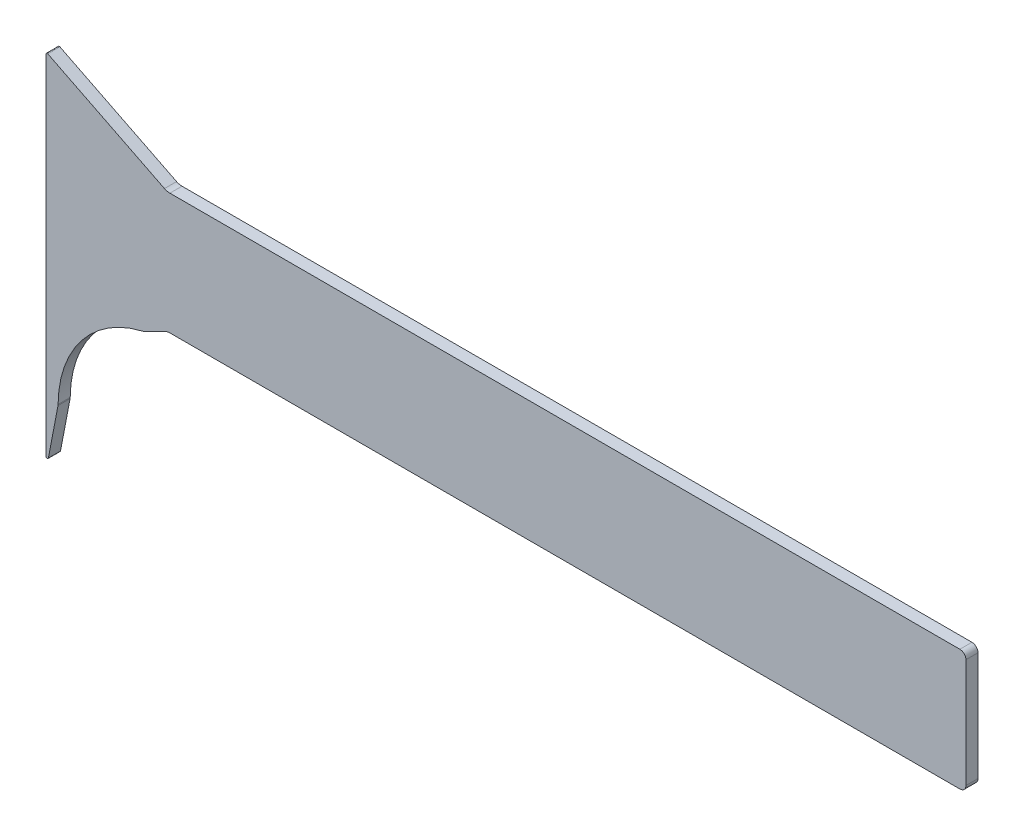
ISO-10303-21;
HEADER;
FILE_DESCRIPTION(('STEP AP214'),'2;1');
FILE_NAME('part.step','',(''),(''),'','','');
FILE_SCHEMA(('AUTOMOTIVE_DESIGN { 1 0 10303 214 1 1 1 1 }'));
ENDSEC;
DATA;
#1=APPLICATION_CONTEXT('core data for automotive mechanical design processes');
#2=APPLICATION_PROTOCOL_DEFINITION('international standard','automotive_design',2000,#1);
#3=PRODUCT_CONTEXT('',#1,'mechanical');
#4=PRODUCT('Part','Part','',(#3));
#5=PRODUCT_RELATED_PRODUCT_CATEGORY('part','',(#4));
#6=PRODUCT_DEFINITION_FORMATION('','',#4);
#7=PRODUCT_DEFINITION_CONTEXT('part definition',#1,'design');
#8=PRODUCT_DEFINITION('design','',#6,#7);
#9=PRODUCT_DEFINITION_SHAPE('','',#8);
#10=(LENGTH_UNIT() NAMED_UNIT(*) SI_UNIT(.MILLI.,.METRE.));
#11=(NAMED_UNIT(*) PLANE_ANGLE_UNIT() SI_UNIT($,.RADIAN.));
#12=(NAMED_UNIT(*) SI_UNIT($,.STERADIAN.) SOLID_ANGLE_UNIT());
#13=UNCERTAINTY_MEASURE_WITH_UNIT(LENGTH_MEASURE(1.E-05),#10,'distance_accuracy_value','');
#14=(GEOMETRIC_REPRESENTATION_CONTEXT(3) GLOBAL_UNCERTAINTY_ASSIGNED_CONTEXT((#13)) GLOBAL_UNIT_ASSIGNED_CONTEXT((#10,
#11,#12)) REPRESENTATION_CONTEXT('',''));
#15=CARTESIAN_POINT('',(0.,0.,0.));
#16=DIRECTION('',(0.,0.,1.));
#17=DIRECTION('',(1.,0.,0.));
#18=AXIS2_PLACEMENT_3D('',#15,#16,#17);
#19=CARTESIAN_POINT('',(102.360679777415,-60.0000000007318,10.));
#20=DIRECTION('',(0.,0.,-1.));
#21=DIRECTION('',(-1.,0.,0.));
#22=AXIS2_PLACEMENT_3D('',#19,#20,#21);
#23=CYLINDRICAL_SURFACE('',#22,10.);
#24=CARTESIAN_POINT('',(102.360679777415,-60.0000000007318,0.));
#25=DIRECTION('',(0.,0.,-1.));
#26=DIRECTION('',(-1.,0.,0.));
#27=AXIS2_PLACEMENT_3D('',#24,#25,#26);
#28=CIRCLE('',#27,10.);
#29=CARTESIAN_POINT('',(97.8885438183196,-51.0557280927806,0.));
#30=VERTEX_POINT('',#29);
#31=CARTESIAN_POINT('',(102.360679777415,-50.0000000007318,0.));
#32=VERTEX_POINT('',#31);
#33=EDGE_CURVE('E177',#30,#32,#28,.T.);
#34=ORIENTED_EDGE('',*,*,#33,.T.);
#35=DIRECTION('',(0.,0.,-1.));
#36=VECTOR('',#35,1.);
#37=CARTESIAN_POINT('',(102.360679777415,-50.0000000007318,10.));
#38=LINE('',#37,#36);
#39=CARTESIAN_POINT('',(102.360679777415,-50.0000000007318,10.));
#40=VERTEX_POINT('',#39);
#41=EDGE_CURVE('E11',#40,#32,#38,.T.);
#42=ORIENTED_EDGE('',*,*,#41,.F.);
#43=CARTESIAN_POINT('',(102.360679777415,-60.0000000007318,10.));
#44=DIRECTION('',(0.,0.,-1.));
#45=DIRECTION('',(-1.,0.,0.));
#46=AXIS2_PLACEMENT_3D('',#43,#44,#45);
#47=CIRCLE('',#46,10.);
#48=CARTESIAN_POINT('',(97.8885438183196,-51.0557280927806,10.));
#49=VERTEX_POINT('',#48);
#50=EDGE_CURVE('E207',#49,#40,#47,.T.);
#51=ORIENTED_EDGE('',*,*,#50,.F.);
#52=DIRECTION('',(0.,0.,-1.));
#53=VECTOR('',#52,1.);
#54=CARTESIAN_POINT('',(97.8885438183196,-51.0557280927806,10.));
#55=LINE('',#54,#53);
#56=EDGE_CURVE('E173',#49,#30,#55,.T.);
#57=ORIENTED_EDGE('',*,*,#56,.T.);
#58=EDGE_LOOP('',(#34,#42,#51,#57));
#59=FACE_BOUND('',#58,.T.);
#60=ADVANCED_FACE('F33',(#59),#23,.F.);
#61=CARTESIAN_POINT('',(102.360679777415,-50.0000000007318,10.));
#62=DIRECTION('',(0.,1.,0.));
#63=DIRECTION('',(0.,0.,1.));
#64=AXIS2_PLACEMENT_3D('',#61,#62,#63);
#65=PLANE('',#64);
#66=DIRECTION('',(1.,0.,0.));
#67=VECTOR('',#66,1.);
#68=CARTESIAN_POINT('',(102.360679777415,-50.0000000007318,0.));
#69=LINE('',#68,#67);
#70=CARTESIAN_POINT('',(755.,-50.0000000007318,0.));
#71=VERTEX_POINT('',#70);
#72=EDGE_CURVE('E180',#32,#71,#69,.T.);
#73=ORIENTED_EDGE('',*,*,#72,.T.);
#74=DIRECTION('',(0.,0.,-1.));
#75=VECTOR('',#74,1.);
#76=CARTESIAN_POINT('',(755.,-50.0000000007318,10.));
#77=LINE('',#76,#75);
#78=CARTESIAN_POINT('',(755.,-50.0000000007318,10.));
#79=VERTEX_POINT('',#78);
#80=EDGE_CURVE('E41',#79,#71,#77,.T.);
#81=ORIENTED_EDGE('',*,*,#80,.F.);
#82=DIRECTION('',(1.,0.,0.));
#83=VECTOR('',#82,1.);
#84=CARTESIAN_POINT('',(102.360679777415,-50.0000000007318,10.));
#85=LINE('',#84,#83);
#86=EDGE_CURVE('E116',#40,#79,#85,.T.);
#87=ORIENTED_EDGE('',*,*,#86,.F.);
#88=ORIENTED_EDGE('',*,*,#41,.T.);
#89=EDGE_LOOP('',(#73,#81,#87,#88));
#90=FACE_BOUND('',#89,.T.);
#91=ADVANCED_FACE('F305',(#90),#65,.F.);
#92=CARTESIAN_POINT('',(755.,-45.0000000007318,10.));
#93=DIRECTION('',(0.,0.,-1.));
#94=DIRECTION('',(-1.,0.,0.));
#95=AXIS2_PLACEMENT_3D('',#92,#93,#94);
#96=CYLINDRICAL_SURFACE('',#95,5.);
#97=CARTESIAN_POINT('',(755.,-45.0000000007318,0.));
#98=DIRECTION('',(0.,0.,1.));
#99=DIRECTION('',(1.,0.,0.));
#100=AXIS2_PLACEMENT_3D('',#97,#98,#99);
#101=CIRCLE('',#100,5.);
#102=CARTESIAN_POINT('',(760.,-45.0000000007318,0.));
#103=VERTEX_POINT('',#102);
#104=EDGE_CURVE('E182',#71,#103,#101,.T.);
#105=ORIENTED_EDGE('',*,*,#104,.T.);
#106=DIRECTION('',(0.,0.,-1.));
#107=VECTOR('',#106,1.);
#108=CARTESIAN_POINT('',(760.,-45.0000000007318,10.));
#109=LINE('',#108,#107);
#110=CARTESIAN_POINT('',(760.,-45.0000000007318,10.));
#111=VERTEX_POINT('',#110);
#112=EDGE_CURVE('E238',#111,#103,#109,.T.);
#113=ORIENTED_EDGE('',*,*,#112,.F.);
#114=CARTESIAN_POINT('',(755.,-45.0000000007318,10.));
#115=DIRECTION('',(0.,0.,1.));
#116=DIRECTION('',(1.,0.,0.));
#117=AXIS2_PLACEMENT_3D('',#114,#115,#116);
#118=CIRCLE('',#117,5.);
#119=EDGE_CURVE('E246',#79,#111,#118,.T.);
#120=ORIENTED_EDGE('',*,*,#119,.F.);
#121=ORIENTED_EDGE('',*,*,#80,.T.);
#122=EDGE_LOOP('',(#105,#113,#120,#121));
#123=FACE_BOUND('',#122,.T.);
#124=ADVANCED_FACE('F244',(#123),#96,.T.);
#125=CARTESIAN_POINT('',(760.,-45.0000000007318,10.));
#126=DIRECTION('',(-1.,0.,0.));
#127=DIRECTION('',(0.,0.,1.));
#128=AXIS2_PLACEMENT_3D('',#125,#126,#127);
#129=PLANE('',#128);
#130=DIRECTION('',(0.,1.,0.));
#131=VECTOR('',#130,1.);
#132=CARTESIAN_POINT('',(760.,-45.0000000007318,0.));
#133=LINE('',#132,#131);
#134=CARTESIAN_POINT('',(760.,45.,0.));
#135=VERTEX_POINT('',#134);
#136=EDGE_CURVE('E184',#103,#135,#133,.T.);
#137=ORIENTED_EDGE('',*,*,#136,.T.);
#138=DIRECTION('',(0.,0.,-1.));
#139=VECTOR('',#138,1.);
#140=CARTESIAN_POINT('',(760.,45.,10.));
#141=LINE('',#140,#139);
#142=CARTESIAN_POINT('',(760.,45.,10.));
#143=VERTEX_POINT('',#142);
#144=EDGE_CURVE('E235',#143,#135,#141,.T.);
#145=ORIENTED_EDGE('',*,*,#144,.F.);
#146=DIRECTION('',(0.,1.,0.));
#147=VECTOR('',#146,1.);
#148=CARTESIAN_POINT('',(760.,-45.0000000007318,10.));
#149=LINE('',#148,#147);
#150=EDGE_CURVE('E264',#111,#143,#149,.T.);
#151=ORIENTED_EDGE('',*,*,#150,.F.);
#152=ORIENTED_EDGE('',*,*,#112,.T.);
#153=EDGE_LOOP('',(#137,#145,#151,#152));
#154=FACE_BOUND('',#153,.T.);
#155=ADVANCED_FACE('F255',(#154),#129,.F.);
#156=CARTESIAN_POINT('',(755.,45.0000000000001,10.));
#157=DIRECTION('',(0.,0.,-1.));
#158=DIRECTION('',(-1.,0.,0.));
#159=AXIS2_PLACEMENT_3D('',#156,#157,#158);
#160=CYLINDRICAL_SURFACE('',#159,5.);
#161=CARTESIAN_POINT('',(755.,45.0000000000001,0.));
#162=DIRECTION('',(0.,0.,1.));
#163=DIRECTION('',(1.,0.,0.));
#164=AXIS2_PLACEMENT_3D('',#161,#162,#163);
#165=CIRCLE('',#164,5.);
#166=CARTESIAN_POINT('',(755.,50.0000000000001,0.));
#167=VERTEX_POINT('',#166);
#168=EDGE_CURVE('E186',#135,#167,#165,.T.);
#169=ORIENTED_EDGE('',*,*,#168,.T.);
#170=DIRECTION('',(0.,0.,-1.));
#171=VECTOR('',#170,1.);
#172=CARTESIAN_POINT('',(755.,50.0000000000001,10.));
#173=LINE('',#172,#171);
#174=CARTESIAN_POINT('',(755.,50.0000000000001,10.));
#175=VERTEX_POINT('',#174);
#176=EDGE_CURVE('E232',#175,#167,#173,.T.);
#177=ORIENTED_EDGE('',*,*,#176,.F.);
#178=CARTESIAN_POINT('',(755.,45.0000000000001,10.));
#179=DIRECTION('',(0.,0.,1.));
#180=DIRECTION('',(1.,0.,0.));
#181=AXIS2_PLACEMENT_3D('',#178,#179,#180);
#182=CIRCLE('',#181,5.);
#183=EDGE_CURVE('E261',#143,#175,#182,.T.);
#184=ORIENTED_EDGE('',*,*,#183,.F.);
#185=ORIENTED_EDGE('',*,*,#144,.T.);
#186=EDGE_LOOP('',(#169,#177,#184,#185));
#187=FACE_BOUND('',#186,.T.);
#188=ADVANCED_FACE('F259',(#187),#160,.T.);
#189=CARTESIAN_POINT('',(755.,50.0000000000001,10.));
#190=DIRECTION('',(0.,-1.,0.));
#191=DIRECTION('',(1.,0.,0.));
#192=AXIS2_PLACEMENT_3D('',#189,#190,#191);
#193=PLANE('',#192);
#194=DIRECTION('',(-1.,0.,0.));
#195=VECTOR('',#194,1.);
#196=CARTESIAN_POINT('',(755.,50.0000000000001,0.));
#197=LINE('',#196,#195);
#198=CARTESIAN_POINT('',(102.360679774998,50.,0.));
#199=VERTEX_POINT('',#198);
#200=EDGE_CURVE('E188',#167,#199,#197,.T.);
#201=ORIENTED_EDGE('',*,*,#200,.T.);
#202=DIRECTION('',(0.,0.,-1.));
#203=VECTOR('',#202,1.);
#204=CARTESIAN_POINT('',(102.360679774998,50.,10.));
#205=LINE('',#204,#203);
#206=CARTESIAN_POINT('',(102.360679774998,50.,10.));
#207=VERTEX_POINT('',#206);
#208=EDGE_CURVE('E229',#207,#199,#205,.T.);
#209=ORIENTED_EDGE('',*,*,#208,.F.);
#210=DIRECTION('',(-1.,0.,0.));
#211=VECTOR('',#210,1.);
#212=CARTESIAN_POINT('',(755.,50.0000000000001,10.));
#213=LINE('',#212,#211);
#214=EDGE_CURVE('E263',#175,#207,#213,.T.);
#215=ORIENTED_EDGE('',*,*,#214,.F.);
#216=ORIENTED_EDGE('',*,*,#176,.T.);
#217=EDGE_LOOP('',(#201,#209,#215,#216));
#218=FACE_BOUND('',#217,.T.);
#219=ADVANCED_FACE('F318',(#218),#193,.F.);
#220=CARTESIAN_POINT('',(102.360679774998,60.,10.));
#221=DIRECTION('',(0.,0.,-1.));
#222=DIRECTION('',(-1.,0.,0.));
#223=AXIS2_PLACEMENT_3D('',#220,#221,#222);
#224=CYLINDRICAL_SURFACE('',#223,10.);
#225=CARTESIAN_POINT('',(102.360679774998,60.,0.));
#226=DIRECTION('',(0.,0.,-1.));
#227=DIRECTION('',(1.,0.,0.));
#228=AXIS2_PLACEMENT_3D('',#225,#226,#227);
#229=CIRCLE('',#228,10.);
#230=CARTESIAN_POINT('',(97.8885438199983,51.0557280900008,0.));
#231=VERTEX_POINT('',#230);
#232=EDGE_CURVE('E190',#199,#231,#229,.T.);
#233=ORIENTED_EDGE('',*,*,#232,.T.);
#234=DIRECTION('',(0.,0.,-1.));
#235=VECTOR('',#234,1.);
#236=CARTESIAN_POINT('',(97.8885438199983,51.0557280900008,10.));
#237=LINE('',#236,#235);
#238=CARTESIAN_POINT('',(97.8885438199983,51.0557280900008,10.));
#239=VERTEX_POINT('',#238);
#240=EDGE_CURVE('E226',#239,#231,#237,.T.);
#241=ORIENTED_EDGE('',*,*,#240,.F.);
#242=CARTESIAN_POINT('',(102.360679774998,60.,10.));
#243=DIRECTION('',(0.,0.,-1.));
#244=DIRECTION('',(1.,0.,0.));
#245=AXIS2_PLACEMENT_3D('',#242,#243,#244);
#246=CIRCLE('',#245,10.);
#247=EDGE_CURVE('E266',#207,#239,#246,.T.);
#248=ORIENTED_EDGE('',*,*,#247,.F.);
#249=ORIENTED_EDGE('',*,*,#208,.T.);
#250=EDGE_LOOP('',(#233,#241,#248,#249));
#251=FACE_BOUND('',#250,.T.);
#252=ADVANCED_FACE('F321',(#251),#224,.F.);
#253=CARTESIAN_POINT('',(1.44721359549995,99.2763932022501,10.));
#254=DIRECTION('',(-0.447213595499958,-0.894427190999916,0.));
#255=DIRECTION('',(0.894427190999916,-0.447213595499958,0.));
#256=AXIS2_PLACEMENT_3D('',#253,#254,#255);
#257=PLANE('',#256);
#258=DIRECTION('',(-0.894427190999916,0.447213595499958,0.));
#259=VECTOR('',#258,1.);
#260=CARTESIAN_POINT('',(1.44721359549995,99.2763932022501,0.));
#261=LINE('',#260,#259);
#262=CARTESIAN_POINT('',(1.44721359549995,99.2763932022501,0.));
#263=VERTEX_POINT('',#262);
#264=EDGE_CURVE('E192',#231,#263,#261,.T.);
#265=ORIENTED_EDGE('',*,*,#264,.T.);
#266=DIRECTION('',(0.,0.,-1.));
#267=VECTOR('',#266,1.);
#268=CARTESIAN_POINT('',(1.44721359549995,99.2763932022501,10.));
#269=LINE('',#268,#267);
#270=CARTESIAN_POINT('',(1.44721359549995,99.2763932022501,10.));
#271=VERTEX_POINT('',#270);
#272=EDGE_CURVE('E223',#271,#263,#269,.T.);
#273=ORIENTED_EDGE('',*,*,#272,.F.);
#274=DIRECTION('',(-0.894427190999916,0.447213595499958,0.));
#275=VECTOR('',#274,1.);
#276=CARTESIAN_POINT('',(1.44721359549995,99.2763932022501,10.));
#277=LINE('',#276,#275);
#278=EDGE_CURVE('E272',#239,#271,#277,.T.);
#279=ORIENTED_EDGE('',*,*,#278,.F.);
#280=ORIENTED_EDGE('',*,*,#240,.T.);
#281=EDGE_LOOP('',(#265,#273,#279,#280));
#282=FACE_BOUND('',#281,.T.);
#283=ADVANCED_FACE('F325',(#282),#257,.F.);
#284=CARTESIAN_POINT('',(0.999999999999997,98.3819660112502,10.));
#285=DIRECTION('',(0.,0.,-1.));
#286=DIRECTION('',(-1.,0.,0.));
#287=AXIS2_PLACEMENT_3D('',#284,#285,#286);
#288=CYLINDRICAL_SURFACE('',#287,0.999999999999997);
#289=CARTESIAN_POINT('',(0.999999999999997,98.3819660112502,0.));
#290=DIRECTION('',(0.,0.,1.));
#291=DIRECTION('',(1.,0.,0.));
#292=AXIS2_PLACEMENT_3D('',#289,#290,#291);
#293=CIRCLE('',#292,0.999999999999997);
#294=CARTESIAN_POINT('',(0.,98.3819660112502,0.));
#295=VERTEX_POINT('',#294);
#296=EDGE_CURVE('E194',#263,#295,#293,.T.);
#297=ORIENTED_EDGE('',*,*,#296,.T.);
#298=DIRECTION('',(0.,0.,-1.));
#299=VECTOR('',#298,1.);
#300=CARTESIAN_POINT('',(0.,98.3819660112502,10.));
#301=LINE('',#300,#299);
#302=CARTESIAN_POINT('',(0.,98.3819660112502,10.));
#303=VERTEX_POINT('',#302);
#304=EDGE_CURVE('E220',#303,#295,#301,.T.);
#305=ORIENTED_EDGE('',*,*,#304,.F.);
#306=CARTESIAN_POINT('',(0.999999999999997,98.3819660112502,10.));
#307=DIRECTION('',(0.,0.,1.));
#308=DIRECTION('',(1.,0.,0.));
#309=AXIS2_PLACEMENT_3D('',#306,#307,#308);
#310=CIRCLE('',#309,0.999999999999997);
#311=EDGE_CURVE('E274',#271,#303,#310,.T.);
#312=ORIENTED_EDGE('',*,*,#311,.F.);
#313=ORIENTED_EDGE('',*,*,#272,.T.);
#314=EDGE_LOOP('',(#297,#305,#312,#313));
#315=FACE_BOUND('',#314,.T.);
#316=ADVANCED_FACE('F329',(#315),#288,.T.);
#317=CARTESIAN_POINT('',(0.,-189.455096235547,10.));
#318=DIRECTION('',(1.,0.,0.));
#319=DIRECTION('',(0.,0.,-1.));
#320=AXIS2_PLACEMENT_3D('',#317,#318,#319);
#321=PLANE('',#320);
#322=DIRECTION('',(0.,-1.,0.));
#323=VECTOR('',#322,1.);
#324=CARTESIAN_POINT('',(0.,-189.455096235547,0.));
#325=LINE('',#324,#323);
#326=CARTESIAN_POINT('',(0.,-189.455096235547,0.));
#327=VERTEX_POINT('',#326);
#328=EDGE_CURVE('E196',#295,#327,#325,.T.);
#329=ORIENTED_EDGE('',*,*,#328,.T.);
#330=DIRECTION('',(0.,0.,-1.));
#331=VECTOR('',#330,1.);
#332=CARTESIAN_POINT('',(0.,-189.455096235547,10.));
#333=LINE('',#332,#331);
#334=CARTESIAN_POINT('',(0.,-189.455096235547,10.));
#335=VERTEX_POINT('',#334);
#336=EDGE_CURVE('E217',#335,#327,#333,.T.);
#337=ORIENTED_EDGE('',*,*,#336,.F.);
#338=DIRECTION('',(0.,-1.,0.));
#339=VECTOR('',#338,1.);
#340=CARTESIAN_POINT('',(0.,-189.455096235547,10.));
#341=LINE('',#340,#339);
#342=EDGE_CURVE('E276',#303,#335,#341,.T.);
#343=ORIENTED_EDGE('',*,*,#342,.F.);
#344=ORIENTED_EDGE('',*,*,#304,.T.);
#345=EDGE_LOOP('',(#329,#337,#343,#344));
#346=FACE_BOUND('',#345,.T.);
#347=ADVANCED_FACE('F333',(#346),#321,.F.);
#348=CARTESIAN_POINT('',(0.999999999999999,-189.455096235547,10.));
#349=DIRECTION('',(0.,0.,-1.));
#350=DIRECTION('',(-1.,0.,0.));
#351=AXIS2_PLACEMENT_3D('',#348,#349,#350);
#352=CYLINDRICAL_SURFACE('',#351,0.999999999999997);
#353=CARTESIAN_POINT('',(0.999999999999999,-189.455096235547,0.));
#354=DIRECTION('',(0.,0.,1.));
#355=DIRECTION('',(-1.,0.,0.));
#356=AXIS2_PLACEMENT_3D('',#353,#354,#355);
#357=CIRCLE('',#356,0.999999999999997);
#358=CARTESIAN_POINT('',(1.98217389293665,-189.643070819024,0.));
#359=VERTEX_POINT('',#358);
#360=EDGE_CURVE('E198',#327,#359,#357,.T.);
#361=ORIENTED_EDGE('',*,*,#360,.T.);
#362=DIRECTION('',(0.,0.,-1.));
#363=VECTOR('',#362,1.);
#364=CARTESIAN_POINT('',(1.98217389293665,-189.643070819024,10.));
#365=LINE('',#364,#363);
#366=CARTESIAN_POINT('',(1.98217389293665,-189.643070819024,10.));
#367=VERTEX_POINT('',#366);
#368=EDGE_CURVE('E214',#367,#359,#365,.T.);
#369=ORIENTED_EDGE('',*,*,#368,.F.);
#370=CARTESIAN_POINT('',(0.999999999999999,-189.455096235547,10.));
#371=DIRECTION('',(0.,0.,1.));
#372=DIRECTION('',(-1.,0.,0.));
#373=AXIS2_PLACEMENT_3D('',#370,#371,#372);
#374=CIRCLE('',#373,0.999999999999997);
#375=EDGE_CURVE('E278',#335,#367,#374,.T.);
#376=ORIENTED_EDGE('',*,*,#375,.F.);
#377=ORIENTED_EDGE('',*,*,#336,.T.);
#378=EDGE_LOOP('',(#361,#369,#376,#377));
#379=FACE_BOUND('',#378,.T.);
#380=ADVANCED_FACE('F337',(#379),#352,.T.);
#381=CARTESIAN_POINT('',(9.91208469394168,-148.209004478969,10.));
#382=DIRECTION('',(-0.982173892936656,0.187974583477804,0.));
#383=DIRECTION('',(-0.187974583477804,-0.982173892936656,0.));
#384=AXIS2_PLACEMENT_3D('',#381,#382,#383);
#385=PLANE('',#384);
#386=DIRECTION('',(0.187974583477804,0.982173892936656,0.));
#387=VECTOR('',#386,1.);
#388=CARTESIAN_POINT('',(9.91208469394168,-148.209004478969,0.));
#389=LINE('',#388,#387);
#390=CARTESIAN_POINT('',(9.91208469394168,-148.209004478969,0.));
#391=VERTEX_POINT('',#390);
#392=EDGE_CURVE('E200',#359,#391,#389,.T.);
#393=ORIENTED_EDGE('',*,*,#392,.T.);
#394=DIRECTION('',(0.,0.,-1.));
#395=VECTOR('',#394,1.);
#396=CARTESIAN_POINT('',(9.91208469394168,-148.209004478969,10.));
#397=LINE('',#396,#395);
#398=CARTESIAN_POINT('',(9.91208469394168,-148.209004478969,10.));
#399=VERTEX_POINT('',#398);
#400=EDGE_CURVE('E211',#399,#391,#397,.T.);
#401=ORIENTED_EDGE('',*,*,#400,.F.);
#402=DIRECTION('',(0.187974583477804,0.982173892936656,0.));
#403=VECTOR('',#402,1.);
#404=CARTESIAN_POINT('',(9.91208469394168,-148.209004478969,10.));
#405=LINE('',#404,#403);
#406=EDGE_CURVE('E280',#367,#399,#405,.T.);
#407=ORIENTED_EDGE('',*,*,#406,.F.);
#408=ORIENTED_EDGE('',*,*,#368,.T.);
#409=EDGE_LOOP('',(#393,#401,#407,#408));
#410=FACE_BOUND('',#409,.T.);
#411=ADVANCED_FACE('F286',(#410),#385,.F.);
#412=CARTESIAN_POINT('',(5.00121522925838,-147.26913156158,10.));
#413=DIRECTION('',(0.,0.,-1.));
#414=DIRECTION('',(-1.,0.,0.));
#415=AXIS2_PLACEMENT_3D('',#412,#413,#414);
#416=CYLINDRICAL_SURFACE('',#415,5.00000000000002);
#417=CARTESIAN_POINT('',(5.00121522925838,-147.26913156158,0.));
#418=DIRECTION('',(0.,0.,1.));
#419=DIRECTION('',(-1.,0.,0.));
#420=AXIS2_PLACEMENT_3D('',#417,#418,#419);
#421=CIRCLE('',#420,5.00000000000002);
#422=CARTESIAN_POINT('',(10.0011512698238,-147.294421683282,0.));
#423=VERTEX_POINT('',#422);
#424=EDGE_CURVE('E202',#391,#423,#421,.T.);
#425=ORIENTED_EDGE('',*,*,#424,.T.);
#426=DIRECTION('',(0.,0.,-1.));
#427=VECTOR('',#426,1.);
#428=CARTESIAN_POINT('',(10.0011512698238,-147.294421683282,10.));
#429=LINE('',#428,#427);
#430=CARTESIAN_POINT('',(10.0011512698238,-147.294421683282,10.));
#431=VERTEX_POINT('',#430);
#432=EDGE_CURVE('E168',#431,#423,#429,.T.);
#433=ORIENTED_EDGE('',*,*,#432,.F.);
#434=CARTESIAN_POINT('',(5.00121522925838,-147.26913156158,10.));
#435=DIRECTION('',(0.,0.,1.));
#436=DIRECTION('',(-1.,0.,0.));
#437=AXIS2_PLACEMENT_3D('',#434,#435,#436);
#438=CIRCLE('',#437,5.00000000000002);
#439=EDGE_CURVE('E159',#399,#431,#438,.T.);
#440=ORIENTED_EDGE('',*,*,#439,.F.);
#441=ORIENTED_EDGE('',*,*,#400,.T.);
#442=EDGE_LOOP('',(#425,#433,#440,#441));
#443=FACE_BOUND('',#442,.T.);
#444=ADVANCED_FACE('F290',(#443),#416,.T.);
#445=CARTESIAN_POINT('',(99.9999999930397,-147.749643873921,10.));
#446=DIRECTION('',(0.,0.,-1.));
#447=DIRECTION('',(-1.,0.,0.));
#448=AXIS2_PLACEMENT_3D('',#445,#446,#447);
#449=CYLINDRICAL_SURFACE('',#448,89.9999999930398);
#450=CARTESIAN_POINT('',(99.9999999930397,-147.749643873921,0.));
#451=DIRECTION('',(0.,0.,-1.));
#452=DIRECTION('',(1.,0.,0.));
#453=AXIS2_PLACEMENT_3D('',#450,#451,#452);
#454=CIRCLE('',#453,89.9999999930398);
#455=CARTESIAN_POINT('',(79.4371707310253,-60.1301822715558,0.));
#456=VERTEX_POINT('',#455);
#457=EDGE_CURVE('E167',#423,#456,#454,.T.);
#458=ORIENTED_EDGE('',*,*,#457,.T.);
#459=DIRECTION('',(0.,0.,-1.));
#460=VECTOR('',#459,1.);
#461=CARTESIAN_POINT('',(79.4371707310253,-60.1301822715558,10.));
#462=LINE('',#461,#460);
#463=CARTESIAN_POINT('',(79.4371707310253,-60.1301822715558,10.));
#464=VERTEX_POINT('',#463);
#465=EDGE_CURVE('E164',#464,#456,#462,.T.);
#466=ORIENTED_EDGE('',*,*,#465,.F.);
#467=CARTESIAN_POINT('',(99.9999999930397,-147.749643873921,10.));
#468=DIRECTION('',(0.,0.,-1.));
#469=DIRECTION('',(1.,0.,0.));
#470=AXIS2_PLACEMENT_3D('',#467,#468,#469);
#471=CIRCLE('',#470,89.9999999930398);
#472=EDGE_CURVE('E153',#431,#464,#471,.T.);
#473=ORIENTED_EDGE('',*,*,#472,.F.);
#474=ORIENTED_EDGE('',*,*,#432,.T.);
#475=EDGE_LOOP('',(#458,#466,#473,#474));
#476=FACE_BOUND('',#475,.T.);
#477=ADVANCED_FACE('F165',(#476),#449,.F.);
#478=CARTESIAN_POINT('',(78.2947913274917,-55.2624344043812,10.));
#479=DIRECTION('',(0.,0.,-1.));
#480=DIRECTION('',(-1.,0.,0.));
#481=AXIS2_PLACEMENT_3D('',#478,#479,#480);
#482=CYLINDRICAL_SURFACE('',#481,5.00000000000001);
#483=CARTESIAN_POINT('',(78.2947913274917,-55.2624344043812,0.));
#484=DIRECTION('',(0.,0.,1.));
#485=DIRECTION('',(1.,0.,0.));
#486=AXIS2_PLACEMENT_3D('',#483,#484,#485);
#487=CIRCLE('',#486,5.00000000000001);
#488=CARTESIAN_POINT('',(80.5308593070395,-59.7345703583568,0.));
#489=VERTEX_POINT('',#488);
#490=EDGE_CURVE('E102',#456,#489,#487,.T.);
#491=ORIENTED_EDGE('',*,*,#490,.T.);
#492=DIRECTION('',(0.,0.,-1.));
#493=VECTOR('',#492,1.);
#494=CARTESIAN_POINT('',(80.5308593070395,-59.7345703583568,10.));
#495=LINE('',#494,#493);
#496=CARTESIAN_POINT('',(80.5308593070395,-59.7345703583568,10.));
#497=VERTEX_POINT('',#496);
#498=EDGE_CURVE('E169',#497,#489,#495,.T.);
#499=ORIENTED_EDGE('',*,*,#498,.F.);
#500=CARTESIAN_POINT('',(78.2947913274917,-55.2624344043812,10.));
#501=DIRECTION('',(0.,0.,1.));
#502=DIRECTION('',(1.,0.,0.));
#503=AXIS2_PLACEMENT_3D('',#500,#501,#502);
#504=CIRCLE('',#503,5.00000000000001);
#505=EDGE_CURVE('E157',#464,#497,#504,.T.);
#506=ORIENTED_EDGE('',*,*,#505,.F.);
#507=ORIENTED_EDGE('',*,*,#465,.T.);
#508=EDGE_LOOP('',(#491,#499,#506,#507));
#509=FACE_BOUND('',#508,.T.);
#510=ADVANCED_FACE('F171',(#509),#482,.T.);
#511=CARTESIAN_POINT('',(97.8885438183196,-51.0557280927806,10.));
#512=DIRECTION('',(-0.447213595909557,0.894427190795116,0.));
#513=DIRECTION('',(-0.894427190795116,-0.447213595909557,0.));
#514=AXIS2_PLACEMENT_3D('',#511,#512,#513);
#515=PLANE('',#514);
#516=DIRECTION('',(0.894427190795116,0.447213595909557,0.));
#517=VECTOR('',#516,1.);
#518=CARTESIAN_POINT('',(97.8885438183196,-51.0557280927806,0.));
#519=LINE('',#518,#517);
#520=EDGE_CURVE('E108',#489,#30,#519,.T.);
#521=ORIENTED_EDGE('',*,*,#520,.T.);
#522=ORIENTED_EDGE('',*,*,#56,.F.);
#523=DIRECTION('',(0.894427190795116,0.447213595909557,0.));
#524=VECTOR('',#523,1.);
#525=CARTESIAN_POINT('',(97.8885438183196,-51.0557280927806,10.));
#526=LINE('',#525,#524);
#527=EDGE_CURVE('E49',#497,#49,#526,.T.);
#528=ORIENTED_EDGE('',*,*,#527,.F.);
#529=ORIENTED_EDGE('',*,*,#498,.T.);
#530=EDGE_LOOP('',(#521,#522,#528,#529));
#531=FACE_BOUND('',#530,.T.);
#532=ADVANCED_FACE('F294',(#531),#515,.F.);
#533=CARTESIAN_POINT('',(102.360679777415,-60.0000000007318,10.));
#534=DIRECTION('',(0.,0.,-1.));
#535=DIRECTION('',(-1.,0.,0.));
#536=AXIS2_PLACEMENT_3D('',#533,#534,#535);
#537=PLANE('',#536);
#538=ORIENTED_EDGE('',*,*,#50,.T.);
#539=ORIENTED_EDGE('',*,*,#86,.T.);
#540=ORIENTED_EDGE('',*,*,#119,.T.);
#541=ORIENTED_EDGE('',*,*,#150,.T.);
#542=ORIENTED_EDGE('',*,*,#183,.T.);
#543=ORIENTED_EDGE('',*,*,#214,.T.);
#544=ORIENTED_EDGE('',*,*,#247,.T.);
#545=ORIENTED_EDGE('',*,*,#278,.T.);
#546=ORIENTED_EDGE('',*,*,#311,.T.);
#547=ORIENTED_EDGE('',*,*,#342,.T.);
#548=ORIENTED_EDGE('',*,*,#375,.T.);
#549=ORIENTED_EDGE('',*,*,#406,.T.);
#550=ORIENTED_EDGE('',*,*,#439,.T.);
#551=ORIENTED_EDGE('',*,*,#472,.T.);
#552=ORIENTED_EDGE('',*,*,#505,.T.);
#553=ORIENTED_EDGE('',*,*,#527,.T.);
#554=EDGE_LOOP('',(#538,#539,#540,#541,#542,#543,#544,#545,#546,#547,#548,#549,#550,#551,#552,#553));
#555=FACE_BOUND('',#554,.T.);
#556=ADVANCED_FACE('F155',(#555),#537,.F.);
#557=CARTESIAN_POINT('',(102.360679777415,-60.0000000007318,0.));
#558=DIRECTION('',(0.,0.,-1.));
#559=DIRECTION('',(-1.,0.,0.));
#560=AXIS2_PLACEMENT_3D('',#557,#558,#559);
#561=PLANE('',#560);
#562=ORIENTED_EDGE('',*,*,#33,.F.);
#563=ORIENTED_EDGE('',*,*,#520,.F.);
#564=ORIENTED_EDGE('',*,*,#490,.F.);
#565=ORIENTED_EDGE('',*,*,#457,.F.);
#566=ORIENTED_EDGE('',*,*,#424,.F.);
#567=ORIENTED_EDGE('',*,*,#392,.F.);
#568=ORIENTED_EDGE('',*,*,#360,.F.);
#569=ORIENTED_EDGE('',*,*,#328,.F.);
#570=ORIENTED_EDGE('',*,*,#296,.F.);
#571=ORIENTED_EDGE('',*,*,#264,.F.);
#572=ORIENTED_EDGE('',*,*,#232,.F.);
#573=ORIENTED_EDGE('',*,*,#200,.F.);
#574=ORIENTED_EDGE('',*,*,#168,.F.);
#575=ORIENTED_EDGE('',*,*,#136,.F.);
#576=ORIENTED_EDGE('',*,*,#104,.F.);
#577=ORIENTED_EDGE('',*,*,#72,.F.);
#578=EDGE_LOOP('',(#562,#563,#564,#565,#566,#567,#568,#569,#570,#571,#572,#573,#574,#575,#576,#577));
#579=FACE_BOUND('',#578,.T.);
#580=ADVANCED_FACE('F250',(#579),#561,.T.);
#581=CLOSED_SHELL('',(#60,#91,#124,#155,#188,#219,#252,#283,#316,#347,#380,#411,#444,#477,#510,
#532,#556,#580));
#582=MANIFOLD_SOLID_BREP('B2',#581);
#583=ADVANCED_BREP_SHAPE_REPRESENTATION('',(#18,#582),#14);
#584=SHAPE_DEFINITION_REPRESENTATION(#9,#583);
ENDSEC;
END-ISO-10303-21;
